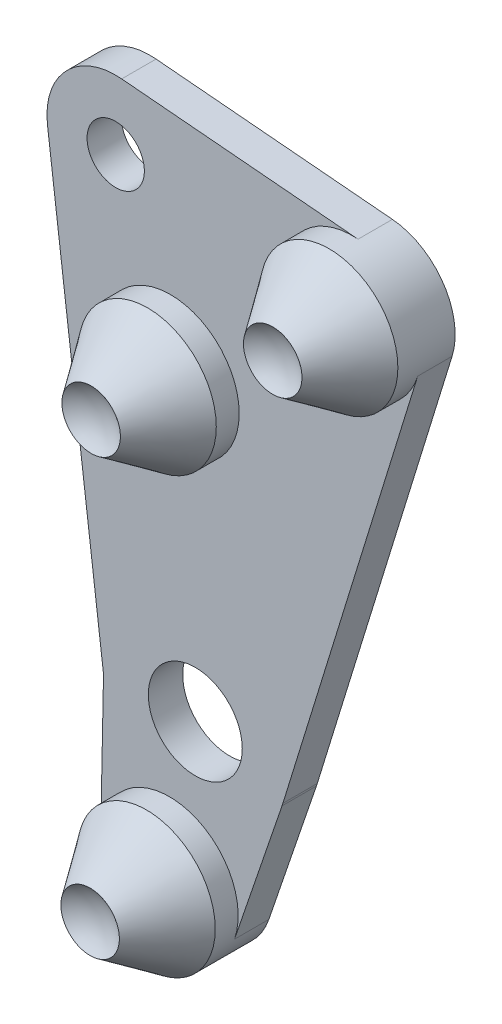
ISO-10303-21;
HEADER;
FILE_DESCRIPTION(('STEP AP214'),'2;1');
FILE_NAME('part.step','',(''),(''),'','','');
FILE_SCHEMA(('AUTOMOTIVE_DESIGN { 1 0 10303 214 1 1 1 1 }'));
ENDSEC;
DATA;
#1=APPLICATION_CONTEXT('core data for automotive mechanical design processes');
#2=APPLICATION_PROTOCOL_DEFINITION('international standard','automotive_design',2000,#1);
#3=PRODUCT_CONTEXT('',#1,'mechanical');
#4=PRODUCT('Part','Part','',(#3));
#5=PRODUCT_RELATED_PRODUCT_CATEGORY('part','',(#4));
#6=PRODUCT_DEFINITION_FORMATION('','',#4);
#7=PRODUCT_DEFINITION_CONTEXT('part definition',#1,'design');
#8=PRODUCT_DEFINITION('design','',#6,#7);
#9=PRODUCT_DEFINITION_SHAPE('','',#8);
#10=(LENGTH_UNIT() NAMED_UNIT(*) SI_UNIT(.MILLI.,.METRE.));
#11=(NAMED_UNIT(*) PLANE_ANGLE_UNIT() SI_UNIT($,.RADIAN.));
#12=(NAMED_UNIT(*) SI_UNIT($,.STERADIAN.) SOLID_ANGLE_UNIT());
#13=UNCERTAINTY_MEASURE_WITH_UNIT(LENGTH_MEASURE(1.E-05),#10,'distance_accuracy_value','');
#14=(GEOMETRIC_REPRESENTATION_CONTEXT(3) GLOBAL_UNCERTAINTY_ASSIGNED_CONTEXT((#13)) GLOBAL_UNIT_ASSIGNED_CONTEXT((#10,
#11,#12)) REPRESENTATION_CONTEXT('',''));
#15=CARTESIAN_POINT('',(0.,0.,0.));
#16=DIRECTION('',(0.,0.,1.));
#17=DIRECTION('',(1.,0.,0.));
#18=AXIS2_PLACEMENT_3D('',#15,#16,#17);
#19=CARTESIAN_POINT('',(0.,0.,3.));
#20=DIRECTION('',(0.,0.,1.));
#21=DIRECTION('',(1.,0.,0.));
#22=AXIS2_PLACEMENT_3D('',#19,#20,#21);
#23=PLANE('',#22);
#24=CARTESIAN_POINT('',(-6.9459271066771,39.3923101204883,3.));
#25=DIRECTION('',(0.,0.,-1.));
#26=DIRECTION('',(-1.,0.,0.));
#27=AXIS2_PLACEMENT_3D('',#24,#25,#26);
#28=CIRCLE('',#27,2.5);
#29=CARTESIAN_POINT('',(-9.4459271066771,39.3923101204883,3.));
#30=VERTEX_POINT('',#29);
#31=EDGE_CURVE('E144',#30,#30,#28,.T.);
#32=ORIENTED_EDGE('',*,*,#31,.T.);
#33=EDGE_LOOP('',(#32));
#34=FACE_BOUND('',#33,.T.);
#35=CARTESIAN_POINT('',(-2.16755626400626,25.1988145551378,3.));
#36=DIRECTION('',(0.,0.,1.));
#37=DIRECTION('',(1.,0.,0.));
#38=AXIS2_PLACEMENT_3D('',#35,#36,#37);
#39=CIRCLE('',#38,6.);
#40=CARTESIAN_POINT('',(3.83244373599374,25.1988145551378,3.));
#41=VERTEX_POINT('',#40);
#42=EDGE_CURVE('E143',#41,#41,#39,.F.);
#43=ORIENTED_EDGE('',*,*,#42,.T.);
#44=EDGE_LOOP('',(#43));
#45=FACE_BOUND('',#44,.T.);
#46=CARTESIAN_POINT('',(0.,0.,3.));
#47=DIRECTION('',(0.,0.,1.));
#48=DIRECTION('',(1.,0.,0.));
#49=AXIS2_PLACEMENT_3D('',#46,#47,#48);
#50=CIRCLE('',#49,4.1);
#51=CARTESIAN_POINT('',(4.1,0.,3.));
#52=VERTEX_POINT('',#51);
#53=EDGE_CURVE('E168',#52,#52,#50,.T.);
#54=ORIENTED_EDGE('',*,*,#53,.F.);
#55=EDGE_LOOP('',(#54));
#56=FACE_BOUND('',#55,.T.);
#57=DIRECTION('',(0.0200719786898944,0.999798537542175,0.));
#58=VECTOR('',#57,1.);
#59=CARTESIAN_POINT('',(-7.9983883003374,0.160575829519156,3.));
#60=LINE('',#59,#58);
#61=CARTESIAN_POINT('',(-8.25621753492311,-12.6820689170193,3.));
#62=VERTEX_POINT('',#61);
#63=CARTESIAN_POINT('',(-8.01001702542376,-0.418658660236086,3.));
#64=VERTEX_POINT('',#63);
#65=EDGE_CURVE('E151',#62,#64,#60,.T.);
#66=ORIENTED_EDGE('',*,*,#65,.F.);
#67=CARTESIAN_POINT('',(-2.25742630967005,-12.8025007891587,3.));
#68=DIRECTION('',(0.,0.,1.));
#69=DIRECTION('',(1.,0.,0.));
#70=AXIS2_PLACEMENT_3D('',#67,#68,#69);
#71=CIRCLE('',#70,6.);
#72=CARTESIAN_POINT('',(3.42078366450559,-14.7410392822437,3.));
#73=VERTEX_POINT('',#72);
#74=EDGE_CURVE('E132',#62,#73,#71,.F.);
#75=ORIENTED_EDGE('',*,*,#74,.T.);
#76=DIRECTION('',(0.323089748847497,0.946368329029275,0.));
#77=VECTOR('',#76,1.);
#78=CARTESIAN_POINT('',(7.57094663223419,-2.58471799077997,3.));
#79=LINE('',#78,#77);
#80=CARTESIAN_POINT('',(7.5709466322342,-2.58471799077997,3.));
#81=VERTEX_POINT('',#80);
#82=EDGE_CURVE('E160',#73,#81,#79,.T.);
#83=ORIENTED_EDGE('',*,*,#82,.T.);
#84=CARTESIAN_POINT('',(0.,0.,3.));
#85=DIRECTION('',(0.,0.,1.));
#86=DIRECTION('',(1.,0.,0.));
#87=AXIS2_PLACEMENT_3D('',#84,#85,#86);
#88=CIRCLE('',#87,8.);
#89=CARTESIAN_POINT('',(7.64494621697795,-2.35686175655565,3.));
#90=VERTEX_POINT('',#89);
#91=EDGE_CURVE('E78',#81,#90,#88,.T.);
#92=ORIENTED_EDGE('',*,*,#91,.T.);
#93=DIRECTION('',(-0.294607719569456,-0.955618277122243,0.));
#94=VECTOR('',#93,1.);
#95=CARTESIAN_POINT('',(7.64494621697795,-2.35686175655565,3.));
#96=LINE('',#95,#94);
#97=CARTESIAN_POINT('',(19.4145153957604,35.8200585140195,3.));
#98=VERTEX_POINT('',#97);
#99=EDGE_CURVE('E197',#98,#90,#96,.T.);
#100=ORIENTED_EDGE('',*,*,#99,.F.);
#101=CARTESIAN_POINT('',(13.6808057330269,37.5877048314363,3.));
#102=DIRECTION('',(0.,0.,1.));
#103=DIRECTION('',(1.,0.,0.));
#104=AXIS2_PLACEMENT_3D('',#101,#102,#103);
#105=CIRCLE('',#104,6.);
#106=CARTESIAN_POINT('',(14.2037401895129,43.5648730199868,3.));
#107=VERTEX_POINT('',#106);
#108=EDGE_CURVE('E334',#98,#107,#105,.F.);
#109=ORIENTED_EDGE('',*,*,#108,.T.);
#110=DIRECTION('',(0.996194698091745,-0.0871557427476612,0.));
#111=VECTOR('',#110,1.);
#112=CARTESIAN_POINT('',(3.89037376966085,44.4671756645128,3.));
#113=LINE('',#112,#111);
#114=CARTESIAN_POINT('',(-6.42299265019113,45.3694783090388,3.));
#115=VERTEX_POINT('',#114);
#116=EDGE_CURVE('E177',#115,#107,#113,.T.);
#117=ORIENTED_EDGE('',*,*,#116,.F.);
#118=CARTESIAN_POINT('',(-6.9459271066771,39.3923101204883,3.));
#119=DIRECTION('',(0.,0.,1.));
#120=DIRECTION('',(1.,0.,0.));
#121=AXIS2_PLACEMENT_3D('',#118,#119,#120);
#122=CIRCLE('',#121,6.);
#123=CARTESIAN_POINT('',(-12.8994773978371,38.6471665567178,3.));
#124=VERTEX_POINT('',#123);
#125=EDGE_CURVE('E183',#115,#124,#122,.T.);
#126=ORIENTED_EDGE('',*,*,#125,.T.);
#127=DIRECTION('',(0.124190593961751,-0.992258381860001,0.));
#128=VECTOR('',#127,1.);
#129=CARTESIAN_POINT('',(-7.93806705488,-0.993524751694007,3.));
#130=LINE('',#129,#128);
#131=EDGE_CURVE('E159',#124,#64,#130,.T.);
#132=ORIENTED_EDGE('',*,*,#131,.T.);
#133=EDGE_LOOP('',(#66,#75,#83,#92,#100,#109,#117,#126,#132));
#134=FACE_BOUND('',#133,.T.);
#135=ADVANCED_FACE('F62',(#34,#45,#56,#134),#23,.T.);
#136=CARTESIAN_POINT('',(0.,0.,3.));
#137=DIRECTION('',(0.,0.,-1.));
#138=DIRECTION('',(-1.,0.,0.));
#139=AXIS2_PLACEMENT_3D('',#136,#137,#138);
#140=CYLINDRICAL_SURFACE('',#139,8.);
#141=ORIENTED_EDGE('',*,*,#91,.F.);
#142=DIRECTION('',(0.,0.,-1.));
#143=VECTOR('',#142,1.);
#144=CARTESIAN_POINT('',(7.57094663223419,-2.58471799077997,3.));
#145=LINE('',#144,#143);
#146=CARTESIAN_POINT('',(7.5709466322342,-2.58471799077997,0.));
#147=VERTEX_POINT('',#146);
#148=EDGE_CURVE('E83',#81,#147,#145,.T.);
#149=ORIENTED_EDGE('',*,*,#148,.T.);
#150=CARTESIAN_POINT('',(0.,0.,0.));
#151=DIRECTION('',(0.,0.,1.));
#152=DIRECTION('',(1.,0.,0.));
#153=AXIS2_PLACEMENT_3D('',#150,#151,#152);
#154=CIRCLE('',#153,8.);
#155=CARTESIAN_POINT('',(7.64494621697795,-2.35686175655565,0.));
#156=VERTEX_POINT('',#155);
#157=EDGE_CURVE('E192',#147,#156,#154,.T.);
#158=ORIENTED_EDGE('',*,*,#157,.T.);
#159=DIRECTION('',(0.,0.,-1.));
#160=VECTOR('',#159,1.);
#161=CARTESIAN_POINT('',(7.64494621697795,-2.35686175655565,3.));
#162=LINE('',#161,#160);
#163=EDGE_CURVE('E208',#90,#156,#162,.T.);
#164=ORIENTED_EDGE('',*,*,#163,.F.);
#165=EDGE_LOOP('',(#141,#149,#158,#164));
#166=FACE_BOUND('',#165,.T.);
#167=ADVANCED_FACE('F245',(#166),#140,.T.);
#168=CARTESIAN_POINT('',(13.6808057330269,37.5877048314363,3.));
#169=DIRECTION('',(0.,0.,-1.));
#170=DIRECTION('',(-1.,0.,0.));
#171=AXIS2_PLACEMENT_3D('',#168,#169,#170);
#172=CYLINDRICAL_SURFACE('',#171,6.);
#173=CARTESIAN_POINT('',(13.6808057330269,37.5877048314363,4.99999999999998));
#174=DIRECTION('',(0.,0.,1.));
#175=DIRECTION('',(1.,0.,0.));
#176=AXIS2_PLACEMENT_3D('',#173,#174,#175);
#177=CIRCLE('',#176,6.);
#178=CARTESIAN_POINT('',(19.6808057330269,37.5877048314363,4.99999999999998));
#179=VERTEX_POINT('',#178);
#180=EDGE_CURVE('E12',#179,#179,#177,.F.);
#181=ORIENTED_EDGE('',*,*,#180,.T.);
#182=EDGE_LOOP('',(#181));
#183=FACE_BOUND('',#182,.T.);
#184=DIRECTION('',(0.,0.,-1.));
#185=VECTOR('',#184,1.);
#186=CARTESIAN_POINT('',(14.2037401895129,43.5648730199868,3.));
#187=LINE('',#186,#185);
#188=CARTESIAN_POINT('',(14.2037401895129,43.5648730199868,0.));
#189=VERTEX_POINT('',#188);
#190=EDGE_CURVE('E187',#107,#189,#187,.T.);
#191=ORIENTED_EDGE('',*,*,#190,.F.);
#192=ORIENTED_EDGE('',*,*,#108,.F.);
#193=DIRECTION('',(0.,0.,-1.));
#194=VECTOR('',#193,1.);
#195=CARTESIAN_POINT('',(19.4145153957604,35.8200585140195,3.));
#196=LINE('',#195,#194);
#197=CARTESIAN_POINT('',(19.4145153957604,35.8200585140195,0.));
#198=VERTEX_POINT('',#197);
#199=EDGE_CURVE('E201',#98,#198,#196,.T.);
#200=ORIENTED_EDGE('',*,*,#199,.T.);
#201=CARTESIAN_POINT('',(13.6808057330269,37.5877048314363,0.));
#202=DIRECTION('',(0.,0.,1.));
#203=DIRECTION('',(1.,0.,0.));
#204=AXIS2_PLACEMENT_3D('',#201,#202,#203);
#205=CIRCLE('',#204,6.);
#206=EDGE_CURVE('E198',#198,#189,#205,.T.);
#207=ORIENTED_EDGE('',*,*,#206,.T.);
#208=EDGE_LOOP('',(#191,#192,#200,#207));
#209=FACE_BOUND('',#208,.T.);
#210=ADVANCED_FACE('F252',(#183,#209),#172,.T.);
#211=CARTESIAN_POINT('',(7.64494621697795,-2.35686175655565,3.));
#212=DIRECTION('',(0.955618277122243,-0.294607719569456,0.));
#213=DIRECTION('',(0.294607719569456,0.955618277122243,0.));
#214=AXIS2_PLACEMENT_3D('',#211,#212,#213);
#215=PLANE('',#214);
#216=DIRECTION('',(-0.294607719569456,-0.955618277122243,0.));
#217=VECTOR('',#216,1.);
#218=CARTESIAN_POINT('',(7.64494621697795,-2.35686175655565,0.));
#219=LINE('',#218,#217);
#220=EDGE_CURVE('E203',#198,#156,#219,.T.);
#221=ORIENTED_EDGE('',*,*,#220,.F.);
#222=ORIENTED_EDGE('',*,*,#199,.F.);
#223=ORIENTED_EDGE('',*,*,#99,.T.);
#224=ORIENTED_EDGE('',*,*,#163,.T.);
#225=EDGE_LOOP('',(#221,#222,#223,#224));
#226=FACE_BOUND('',#225,.T.);
#227=ADVANCED_FACE('F263',(#226),#215,.T.);
#228=CARTESIAN_POINT('',(0.,0.,0.));
#229=DIRECTION('',(0.,0.,1.));
#230=DIRECTION('',(1.,0.,0.));
#231=AXIS2_PLACEMENT_3D('',#228,#229,#230);
#232=PLANE('',#231);
#233=CARTESIAN_POINT('',(-6.9459271066771,39.3923101204883,0.));
#234=DIRECTION('',(0.,0.,-1.));
#235=DIRECTION('',(-1.,0.,0.));
#236=AXIS2_PLACEMENT_3D('',#233,#234,#235);
#237=CIRCLE('',#236,2.5);
#238=CARTESIAN_POINT('',(-9.4459271066771,39.3923101204883,0.));
#239=VERTEX_POINT('',#238);
#240=EDGE_CURVE('E342',#239,#239,#237,.T.);
#241=ORIENTED_EDGE('',*,*,#240,.F.);
#242=EDGE_LOOP('',(#241));
#243=FACE_BOUND('',#242,.T.);
#244=DIRECTION('',(0.323089748847497,0.946368329029275,0.));
#245=VECTOR('',#244,1.);
#246=CARTESIAN_POINT('',(7.57094663223419,-2.58471799077997,0.));
#247=LINE('',#246,#245);
#248=CARTESIAN_POINT('',(3.42078366450559,-14.7410392822437,0.));
#249=VERTEX_POINT('',#248);
#250=EDGE_CURVE('E161',#249,#147,#247,.T.);
#251=ORIENTED_EDGE('',*,*,#250,.F.);
#252=CARTESIAN_POINT('',(-2.25742630967005,-12.8025007891587,0.));
#253=DIRECTION('',(0.,0.,1.));
#254=DIRECTION('',(1.,0.,0.));
#255=AXIS2_PLACEMENT_3D('',#252,#253,#254);
#256=CIRCLE('',#255,6.);
#257=CARTESIAN_POINT('',(-8.25621753492311,-12.6820689170193,0.));
#258=VERTEX_POINT('',#257);
#259=EDGE_CURVE('E165',#258,#249,#256,.T.);
#260=ORIENTED_EDGE('',*,*,#259,.F.);
#261=DIRECTION('',(0.0200719786898944,0.999798537542175,0.));
#262=VECTOR('',#261,1.);
#263=CARTESIAN_POINT('',(-7.9983883003374,0.160575829519156,0.));
#264=LINE('',#263,#262);
#265=CARTESIAN_POINT('',(-8.01001702542376,-0.418658660236086,0.));
#266=VERTEX_POINT('',#265);
#267=EDGE_CURVE('E153',#258,#266,#264,.T.);
#268=ORIENTED_EDGE('',*,*,#267,.T.);
#269=DIRECTION('',(0.124190593961751,-0.992258381860001,0.));
#270=VECTOR('',#269,1.);
#271=CARTESIAN_POINT('',(-7.93806705488,-0.993524751694007,0.));
#272=LINE('',#271,#270);
#273=CARTESIAN_POINT('',(-12.8994773978371,38.6471665567178,0.));
#274=VERTEX_POINT('',#273);
#275=EDGE_CURVE('E181',#274,#266,#272,.T.);
#276=ORIENTED_EDGE('',*,*,#275,.F.);
#277=CARTESIAN_POINT('',(-6.9459271066771,39.3923101204883,0.));
#278=DIRECTION('',(0.,0.,1.));
#279=DIRECTION('',(1.,0.,0.));
#280=AXIS2_PLACEMENT_3D('',#277,#278,#279);
#281=CIRCLE('',#280,6.);
#282=CARTESIAN_POINT('',(-6.42299265019113,45.3694783090388,0.));
#283=VERTEX_POINT('',#282);
#284=EDGE_CURVE('E154',#283,#274,#281,.T.);
#285=ORIENTED_EDGE('',*,*,#284,.F.);
#286=DIRECTION('',(0.996194698091745,-0.0871557427476612,0.));
#287=VECTOR('',#286,1.);
#288=CARTESIAN_POINT('',(3.89037376966085,44.4671756645128,0.));
#289=LINE('',#288,#287);
#290=EDGE_CURVE('E178',#283,#189,#289,.T.);
#291=ORIENTED_EDGE('',*,*,#290,.T.);
#292=ORIENTED_EDGE('',*,*,#206,.F.);
#293=ORIENTED_EDGE('',*,*,#220,.T.);
#294=ORIENTED_EDGE('',*,*,#157,.F.);
#295=EDGE_LOOP('',(#251,#260,#268,#276,#285,#291,#292,#293,#294));
#296=FACE_BOUND('',#295,.T.);
#297=CARTESIAN_POINT('',(0.,0.,0.));
#298=DIRECTION('',(0.,0.,1.));
#299=DIRECTION('',(1.,0.,0.));
#300=AXIS2_PLACEMENT_3D('',#297,#298,#299);
#301=CIRCLE('',#300,4.1);
#302=CARTESIAN_POINT('',(4.1,0.,0.));
#303=VERTEX_POINT('',#302);
#304=EDGE_CURVE('E172',#303,#303,#301,.T.);
#305=ORIENTED_EDGE('',*,*,#304,.T.);
#306=EDGE_LOOP('',(#305));
#307=FACE_BOUND('',#306,.T.);
#308=ADVANCED_FACE('F260',(#243,#296,#307),#232,.F.);
#309=CARTESIAN_POINT('',(-7.93806705488,-0.993524751694007,3.));
#310=DIRECTION('',(0.992258381860001,0.124190593961751,0.));
#311=DIRECTION('',(-0.124190593961751,0.992258381860001,0.));
#312=AXIS2_PLACEMENT_3D('',#309,#310,#311);
#313=PLANE('',#312);
#314=ORIENTED_EDGE('',*,*,#275,.T.);
#315=DIRECTION('',(0.,0.,1.));
#316=VECTOR('',#315,1.);
#317=CARTESIAN_POINT('',(-8.01001702542376,-0.418658660236103,3.));
#318=LINE('',#317,#316);
#319=EDGE_CURVE('E211',#266,#64,#318,.T.);
#320=ORIENTED_EDGE('',*,*,#319,.T.);
#321=ORIENTED_EDGE('',*,*,#131,.F.);
#322=DIRECTION('',(0.,0.,-1.));
#323=VECTOR('',#322,1.);
#324=CARTESIAN_POINT('',(-12.8994773978371,38.6471665567178,3.));
#325=LINE('',#324,#323);
#326=EDGE_CURVE('E190',#124,#274,#325,.T.);
#327=ORIENTED_EDGE('',*,*,#326,.T.);
#328=EDGE_LOOP('',(#314,#320,#321,#327));
#329=FACE_BOUND('',#328,.T.);
#330=ADVANCED_FACE('F262',(#329),#313,.F.);
#331=CARTESIAN_POINT('',(3.89037376966085,44.4671756645128,3.));
#332=DIRECTION('',(0.0871557427476612,0.996194698091745,0.));
#333=DIRECTION('',(-0.996194698091745,0.0871557427476612,0.));
#334=AXIS2_PLACEMENT_3D('',#331,#332,#333);
#335=PLANE('',#334);
#336=ORIENTED_EDGE('',*,*,#290,.F.);
#337=DIRECTION('',(0.,0.,-1.));
#338=VECTOR('',#337,1.);
#339=CARTESIAN_POINT('',(-6.42299265019113,45.3694783090388,3.));
#340=LINE('',#339,#338);
#341=EDGE_CURVE('E180',#115,#283,#340,.T.);
#342=ORIENTED_EDGE('',*,*,#341,.F.);
#343=ORIENTED_EDGE('',*,*,#116,.T.);
#344=ORIENTED_EDGE('',*,*,#190,.T.);
#345=EDGE_LOOP('',(#336,#342,#343,#344));
#346=FACE_BOUND('',#345,.T.);
#347=ADVANCED_FACE('F316',(#346),#335,.T.);
#348=CARTESIAN_POINT('',(-6.9459271066771,39.3923101204883,3.));
#349=DIRECTION('',(0.,0.,-1.));
#350=DIRECTION('',(-1.,0.,0.));
#351=AXIS2_PLACEMENT_3D('',#348,#349,#350);
#352=CYLINDRICAL_SURFACE('',#351,6.);
#353=ORIENTED_EDGE('',*,*,#284,.T.);
#354=ORIENTED_EDGE('',*,*,#326,.F.);
#355=ORIENTED_EDGE('',*,*,#125,.F.);
#356=ORIENTED_EDGE('',*,*,#341,.T.);
#357=EDGE_LOOP('',(#353,#354,#355,#356));
#358=FACE_BOUND('',#357,.T.);
#359=ADVANCED_FACE('F258',(#358),#352,.T.);
#360=CARTESIAN_POINT('',(-7.9983883003374,0.160575829519156,3.));
#361=DIRECTION('',(-0.999798537542175,0.0200719786898944,0.));
#362=DIRECTION('',(-0.0200719786898944,-0.999798537542175,0.));
#363=AXIS2_PLACEMENT_3D('',#360,#361,#362);
#364=PLANE('',#363);
#365=ORIENTED_EDGE('',*,*,#319,.F.);
#366=ORIENTED_EDGE('',*,*,#267,.F.);
#367=DIRECTION('',(0.,0.,-1.));
#368=VECTOR('',#367,1.);
#369=CARTESIAN_POINT('',(-8.25621753492311,-12.6820689170193,3.));
#370=LINE('',#369,#368);
#371=EDGE_CURVE('E136',#62,#258,#370,.T.);
#372=ORIENTED_EDGE('',*,*,#371,.F.);
#373=ORIENTED_EDGE('',*,*,#65,.T.);
#374=EDGE_LOOP('',(#365,#366,#372,#373));
#375=FACE_BOUND('',#374,.T.);
#376=ADVANCED_FACE('F150',(#375),#364,.T.);
#377=CARTESIAN_POINT('',(-2.25742630967005,-12.8025007891587,3.));
#378=DIRECTION('',(0.,0.,-1.));
#379=DIRECTION('',(-1.,0.,0.));
#380=AXIS2_PLACEMENT_3D('',#377,#378,#379);
#381=CYLINDRICAL_SURFACE('',#380,6.);
#382=CARTESIAN_POINT('',(-2.25742630967005,-12.8025007891587,4.99999999999998));
#383=DIRECTION('',(0.,0.,1.));
#384=DIRECTION('',(1.,0.,0.));
#385=AXIS2_PLACEMENT_3D('',#382,#383,#384);
#386=CIRCLE('',#385,6.);
#387=CARTESIAN_POINT('',(3.74257369032995,-12.8025007891587,4.99999999999998));
#388=VERTEX_POINT('',#387);
#389=EDGE_CURVE('E224',#388,#388,#386,.F.);
#390=ORIENTED_EDGE('',*,*,#389,.T.);
#391=EDGE_LOOP('',(#390));
#392=FACE_BOUND('',#391,.T.);
#393=ORIENTED_EDGE('',*,*,#259,.T.);
#394=DIRECTION('',(0.,0.,-1.));
#395=VECTOR('',#394,1.);
#396=CARTESIAN_POINT('',(3.42078366450559,-14.7410392822437,3.));
#397=LINE('',#396,#395);
#398=EDGE_CURVE('E139',#73,#249,#397,.T.);
#399=ORIENTED_EDGE('',*,*,#398,.F.);
#400=ORIENTED_EDGE('',*,*,#74,.F.);
#401=ORIENTED_EDGE('',*,*,#371,.T.);
#402=EDGE_LOOP('',(#393,#399,#400,#401));
#403=FACE_BOUND('',#402,.T.);
#404=ADVANCED_FACE('F135',(#392,#403),#381,.T.);
#405=CARTESIAN_POINT('',(7.57094663223419,-2.58471799077997,3.));
#406=DIRECTION('',(-0.946368329029275,0.323089748847497,0.));
#407=DIRECTION('',(-0.323089748847497,-0.946368329029275,0.));
#408=AXIS2_PLACEMENT_3D('',#405,#406,#407);
#409=PLANE('',#408);
#410=ORIENTED_EDGE('',*,*,#250,.T.);
#411=ORIENTED_EDGE('',*,*,#148,.F.);
#412=ORIENTED_EDGE('',*,*,#82,.F.);
#413=ORIENTED_EDGE('',*,*,#398,.T.);
#414=EDGE_LOOP('',(#410,#411,#412,#413));
#415=FACE_BOUND('',#414,.T.);
#416=ADVANCED_FACE('F306',(#415),#409,.F.);
#417=CARTESIAN_POINT('',(0.,0.,-47.));
#418=DIRECTION('',(0.,0.,1.));
#419=DIRECTION('',(1.,0.,0.));
#420=AXIS2_PLACEMENT_3D('',#417,#418,#419);
#421=CYLINDRICAL_SURFACE('',#420,4.1);
#422=ORIENTED_EDGE('',*,*,#53,.T.);
#423=EDGE_LOOP('',(#422));
#424=FACE_BOUND('',#423,.T.);
#425=ORIENTED_EDGE('',*,*,#304,.F.);
#426=EDGE_LOOP('',(#425));
#427=FACE_BOUND('',#426,.T.);
#428=ADVANCED_FACE('F302',(#424,#427),#421,.F.);
#429=CARTESIAN_POINT('',(-2.16755626400626,25.1988145551378,10.));
#430=DIRECTION('',(0.,0.,-1.));
#431=DIRECTION('',(-1.,0.,0.));
#432=AXIS2_PLACEMENT_3D('',#429,#430,#431);
#433=CYLINDRICAL_SURFACE('',#432,6.);
#434=CARTESIAN_POINT('',(-2.16755626400626,25.1988145551378,4.99999999999998));
#435=DIRECTION('',(0.,0.,1.));
#436=DIRECTION('',(1.,0.,0.));
#437=AXIS2_PLACEMENT_3D('',#434,#435,#436);
#438=CIRCLE('',#437,6.);
#439=CARTESIAN_POINT('',(3.83244373599374,25.1988145551378,4.99999999999998));
#440=VERTEX_POINT('',#439);
#441=EDGE_CURVE('E218',#440,#440,#438,.F.);
#442=ORIENTED_EDGE('',*,*,#441,.T.);
#443=EDGE_LOOP('',(#442));
#444=FACE_BOUND('',#443,.T.);
#445=ORIENTED_EDGE('',*,*,#42,.F.);
#446=EDGE_LOOP('',(#445));
#447=FACE_BOUND('',#446,.T.);
#448=ADVANCED_FACE('F297',(#444,#447),#433,.T.);
#449=CARTESIAN_POINT('',(13.6808057330269,37.5877048314363,13.));
#450=DIRECTION('',(0.,1.,0.));
#451=DIRECTION('',(0.,0.,-1.));
#452=AXIS2_PLACEMENT_3D('',#449,#450,#451);
#453=SPHERICAL_SURFACE('',#452,3.99999999999999);
#454=CARTESIAN_POINT('',(13.6808057330269,37.5877048314363,13.));
#455=DIRECTION('',(0.,0.,-1.));
#456=DIRECTION('',(-1.,0.,0.));
#457=AXIS2_PLACEMENT_3D('',#454,#455,#456);
#458=SPHERICAL_SURFACE('',#457,3.99999999999999);
#459=CARTESIAN_POINT('',(13.6808057330269,37.5877048314363,9.92147057076465));
#460=DIRECTION('',(0.,0.,-1.));
#461=DIRECTION('',(-1.,0.,0.));
#462=AXIS2_PLACEMENT_3D('',#459,#460,#461);
#463=CIRCLE('',#462,2.55394920727328);
#464=CARTESIAN_POINT('',(11.1268565257536,37.5877048314363,9.92147057076465));
#465=VERTEX_POINT('',#464);
#466=EDGE_CURVE('E71',#465,#465,#463,.F.);
#467=ORIENTED_EDGE('',*,*,#466,.T.);
#468=EDGE_LOOP('',(#467));
#469=FACE_BOUND('',#468,.T.);
#470=ADVANCED_FACE('F229',(#469),#458,.F.);
#471=CARTESIAN_POINT('',(-2.16755626400626,25.1988145551378,13.));
#472=DIRECTION('',(0.,1.,0.));
#473=DIRECTION('',(0.,0.,-1.));
#474=AXIS2_PLACEMENT_3D('',#471,#472,#473);
#475=SPHERICAL_SURFACE('',#474,4.);
#476=CARTESIAN_POINT('',(-2.16755626400626,25.1988145551378,13.));
#477=DIRECTION('',(0.,0.,-1.));
#478=DIRECTION('',(-1.,0.,0.));
#479=AXIS2_PLACEMENT_3D('',#476,#477,#478);
#480=SPHERICAL_SURFACE('',#479,4.);
#481=CARTESIAN_POINT('',(-2.16755626400626,25.1988145551378,9.92147057076465));
#482=DIRECTION('',(0.,0.,-1.));
#483=DIRECTION('',(-1.,0.,0.));
#484=AXIS2_PLACEMENT_3D('',#481,#482,#483);
#485=CIRCLE('',#484,2.55394920727329);
#486=CARTESIAN_POINT('',(-4.72150547127955,25.1988145551378,9.92147057076465));
#487=VERTEX_POINT('',#486);
#488=EDGE_CURVE('E213',#487,#487,#485,.F.);
#489=ORIENTED_EDGE('',*,*,#488,.T.);
#490=EDGE_LOOP('',(#489));
#491=FACE_BOUND('',#490,.T.);
#492=ADVANCED_FACE('F285',(#491),#480,.F.);
#493=CARTESIAN_POINT('',(-2.25742630967005,-12.8025007891587,13.));
#494=DIRECTION('',(0.,1.,0.));
#495=DIRECTION('',(0.,0.,-1.));
#496=AXIS2_PLACEMENT_3D('',#493,#494,#495);
#497=SPHERICAL_SURFACE('',#496,4.);
#498=CARTESIAN_POINT('',(-2.25742630967005,-12.8025007891587,13.));
#499=DIRECTION('',(0.,0.,-1.));
#500=DIRECTION('',(-1.,0.,0.));
#501=AXIS2_PLACEMENT_3D('',#498,#499,#500);
#502=SPHERICAL_SURFACE('',#501,4.);
#503=CARTESIAN_POINT('',(-2.25742630967005,-12.8025007891587,9.92147057076465));
#504=DIRECTION('',(0.,0.,-1.));
#505=DIRECTION('',(-1.,0.,0.));
#506=AXIS2_PLACEMENT_3D('',#503,#504,#505);
#507=CIRCLE('',#506,2.55394920727329);
#508=CARTESIAN_POINT('',(-4.81137551694334,-12.8025007891587,9.92147057076465));
#509=VERTEX_POINT('',#508);
#510=EDGE_CURVE('E221',#509,#509,#507,.F.);
#511=ORIENTED_EDGE('',*,*,#510,.T.);
#512=EDGE_LOOP('',(#511));
#513=FACE_BOUND('',#512,.T.);
#514=ADVANCED_FACE('F276',(#513),#502,.F.);
#515=CARTESIAN_POINT('',(-2.16755626400626,25.1988145551378,10.));
#516=DIRECTION('',(0.,0.,-1.));
#517=DIRECTION('',(-1.,0.,0.));
#518=AXIS2_PLACEMENT_3D('',#515,#516,#517);
#519=CONICAL_SURFACE('',#518,2.49896230895139,0.610865238198022);
#520=ORIENTED_EDGE('',*,*,#441,.F.);
#521=EDGE_LOOP('',(#520));
#522=FACE_BOUND('',#521,.T.);
#523=ORIENTED_EDGE('',*,*,#488,.F.);
#524=EDGE_LOOP('',(#523));
#525=FACE_BOUND('',#524,.T.);
#526=ADVANCED_FACE('F242',(#522,#525),#519,.T.);
#527=CARTESIAN_POINT('',(-2.25742630967005,-12.8025007891587,10.));
#528=DIRECTION('',(0.,0.,-1.));
#529=DIRECTION('',(-1.,0.,0.));
#530=AXIS2_PLACEMENT_3D('',#527,#528,#529);
#531=CONICAL_SURFACE('',#530,2.49896230895139,0.610865238198022);
#532=ORIENTED_EDGE('',*,*,#389,.F.);
#533=EDGE_LOOP('',(#532));
#534=FACE_BOUND('',#533,.T.);
#535=ORIENTED_EDGE('',*,*,#510,.F.);
#536=EDGE_LOOP('',(#535));
#537=FACE_BOUND('',#536,.T.);
#538=ADVANCED_FACE('F233',(#534,#537),#531,.T.);
#539=CARTESIAN_POINT('',(13.6808057330269,37.5877048314363,10.));
#540=DIRECTION('',(0.,0.,-1.));
#541=DIRECTION('',(-1.,0.,0.));
#542=AXIS2_PLACEMENT_3D('',#539,#540,#541);
#543=CONICAL_SURFACE('',#542,2.49896230895139,0.610865238198022);
#544=ORIENTED_EDGE('',*,*,#180,.F.);
#545=EDGE_LOOP('',(#544));
#546=FACE_BOUND('',#545,.T.);
#547=ORIENTED_EDGE('',*,*,#466,.F.);
#548=EDGE_LOOP('',(#547));
#549=FACE_BOUND('',#548,.T.);
#550=ADVANCED_FACE('F65',(#546,#549),#543,.T.);
#551=CARTESIAN_POINT('',(-6.9459271066771,39.3923101204883,3.));
#552=DIRECTION('',(0.,0.,-1.));
#553=DIRECTION('',(-1.,0.,0.));
#554=AXIS2_PLACEMENT_3D('',#551,#552,#553);
#555=CYLINDRICAL_SURFACE('',#554,2.5);
#556=ORIENTED_EDGE('',*,*,#31,.F.);
#557=EDGE_LOOP('',(#556));
#558=FACE_BOUND('',#557,.T.);
#559=ORIENTED_EDGE('',*,*,#240,.T.);
#560=EDGE_LOOP('',(#559));
#561=FACE_BOUND('',#560,.T.);
#562=ADVANCED_FACE('F232',(#558,#561),#555,.F.);
#563=CLOSED_SHELL('',(#135,#167,#210,#227,#308,#330,#347,#359,#376,#404,#416,#428,#448,#470,
#492,#514,#526,#538,#550,#562));
#564=MANIFOLD_SOLID_BREP('B2',#563);
#565=ADVANCED_BREP_SHAPE_REPRESENTATION('',(#18,#564),#14);
#566=SHAPE_DEFINITION_REPRESENTATION(#9,#565);
ENDSEC;
END-ISO-10303-21;
